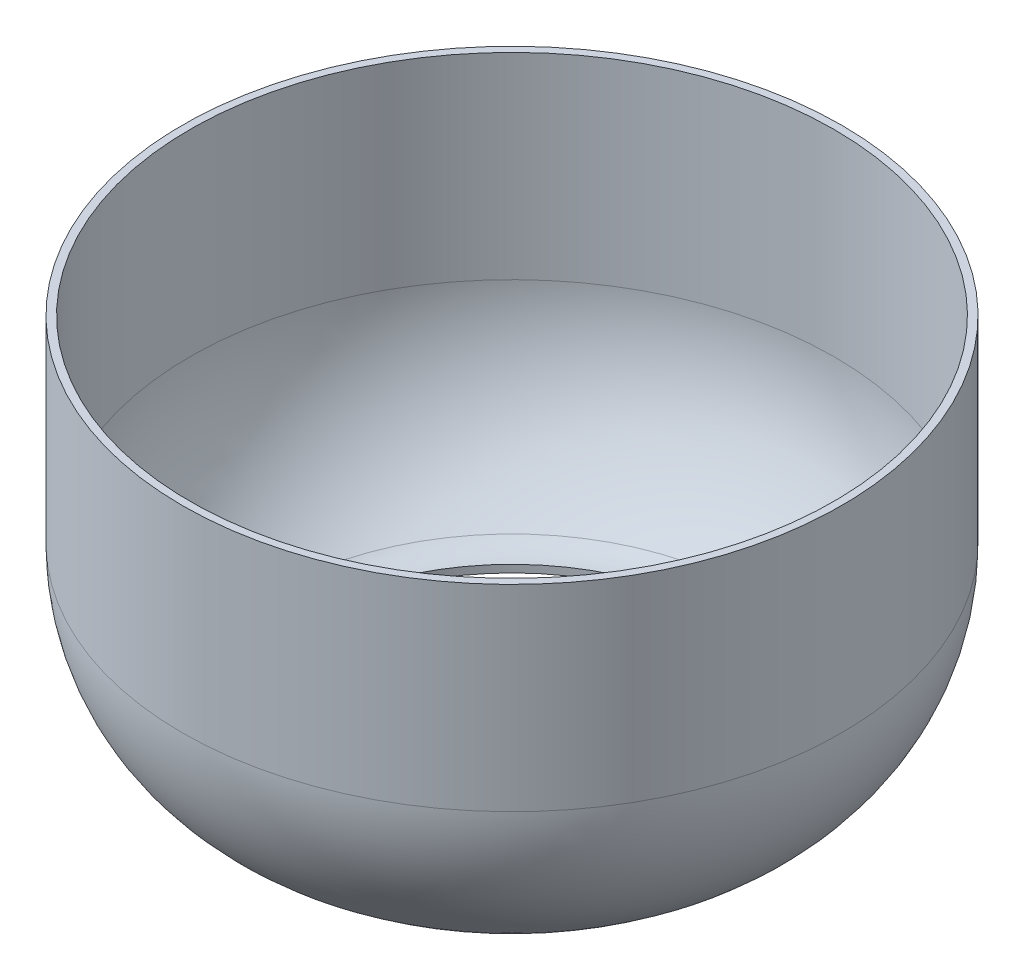
ISO-10303-21;
HEADER;
FILE_DESCRIPTION(('STEP AP214'),'2;1');
FILE_NAME('part.step','',(''),(''),'','','');
FILE_SCHEMA(('AUTOMOTIVE_DESIGN { 1 0 10303 214 1 1 1 1 }'));
ENDSEC;
DATA;
#1=APPLICATION_CONTEXT('core data for automotive mechanical design processes');
#2=APPLICATION_PROTOCOL_DEFINITION('international standard','automotive_design',2000,#1);
#3=PRODUCT_CONTEXT('',#1,'mechanical');
#4=PRODUCT('Part','Part','',(#3));
#5=PRODUCT_RELATED_PRODUCT_CATEGORY('part','',(#4));
#6=PRODUCT_DEFINITION_FORMATION('','',#4);
#7=PRODUCT_DEFINITION_CONTEXT('part definition',#1,'design');
#8=PRODUCT_DEFINITION('design','',#6,#7);
#9=PRODUCT_DEFINITION_SHAPE('','',#8);
#10=(LENGTH_UNIT() NAMED_UNIT(*) SI_UNIT(.MILLI.,.METRE.));
#11=(NAMED_UNIT(*) PLANE_ANGLE_UNIT() SI_UNIT($,.RADIAN.));
#12=(NAMED_UNIT(*) SI_UNIT($,.STERADIAN.) SOLID_ANGLE_UNIT());
#13=UNCERTAINTY_MEASURE_WITH_UNIT(LENGTH_MEASURE(1.E-05),#10,'distance_accuracy_value','');
#14=(GEOMETRIC_REPRESENTATION_CONTEXT(3) GLOBAL_UNCERTAINTY_ASSIGNED_CONTEXT((#13)) GLOBAL_UNIT_ASSIGNED_CONTEXT((#10,
#11,#12)) REPRESENTATION_CONTEXT('',''));
#15=CARTESIAN_POINT('',(0.,0.,0.));
#16=DIRECTION('',(0.,0.,1.));
#17=DIRECTION('',(1.,0.,0.));
#18=AXIS2_PLACEMENT_3D('',#15,#16,#17);
#19=CARTESIAN_POINT('',(0.,0.,0.));
#20=DIRECTION('',(0.,-1.,0.));
#21=DIRECTION('',(0.,0.,-1.));
#22=AXIS2_PLACEMENT_3D('',#19,#20,#21);
#23=DEGENERATE_TOROIDAL_SURFACE('',#22,25.12,39.38,.T.);
#24=CARTESIAN_POINT('',(0.,0.,0.));
#25=DIRECTION('',(0.,-1.,0.));
#26=DIRECTION('',(0.,0.,-1.));
#27=AXIS2_PLACEMENT_3D('',#24,#25,#26);
#28=CIRCLE('',#27,64.5);
#29=CARTESIAN_POINT('',(0.,0.,-64.5));
#30=VERTEX_POINT('',#29);
#31=EDGE_CURVE('E10',#30,#30,#28,.T.);
#32=ORIENTED_EDGE('',*,*,#31,.F.);
#33=EDGE_LOOP('',(#32));
#34=FACE_BOUND('',#33,.T.);
#35=CARTESIAN_POINT('',(0.,-32.2424353474893,0.));
#36=DIRECTION('',(0.,-1.,0.));
#37=DIRECTION('',(0.,0.,-1.));
#38=AXIS2_PLACEMENT_3D('',#35,#36,#37);
#39=CIRCLE('',#38,47.7299483162385);
#40=CARTESIAN_POINT('',(0.,-32.2424353474893,-47.7299483162385));
#41=VERTEX_POINT('',#40);
#42=EDGE_CURVE('E59',#41,#41,#39,.T.);
#43=ORIENTED_EDGE('',*,*,#42,.T.);
#44=EDGE_LOOP('',(#43));
#45=FACE_BOUND('',#44,.T.);
#46=ADVANCED_FACE('F31',(#34,#45),#23,.F.);
#47=CARTESIAN_POINT('',(0.,0.,0.));
#48=DIRECTION('',(0.,-1.,0.));
#49=DIRECTION('',(0.,0.,-1.));
#50=AXIS2_PLACEMENT_3D('',#47,#48,#49);
#51=CYLINDRICAL_SURFACE('',#50,64.5);
#52=CARTESIAN_POINT('',(0.,39.42,0.));
#53=DIRECTION('',(0.,-1.,0.));
#54=DIRECTION('',(0.,0.,-1.));
#55=AXIS2_PLACEMENT_3D('',#52,#53,#54);
#56=CIRCLE('',#55,64.5);
#57=CARTESIAN_POINT('',(0.,39.42,-64.5));
#58=VERTEX_POINT('',#57);
#59=EDGE_CURVE('E37',#58,#58,#56,.T.);
#60=ORIENTED_EDGE('',*,*,#59,.F.);
#61=EDGE_LOOP('',(#60));
#62=FACE_BOUND('',#61,.T.);
#63=ORIENTED_EDGE('',*,*,#31,.T.);
#64=EDGE_LOOP('',(#63));
#65=FACE_BOUND('',#64,.T.);
#66=ADVANCED_FACE('F96',(#62,#65),#51,.F.);
#67=CARTESIAN_POINT('',(-66.,39.42,0.));
#68=DIRECTION('',(0.,-1.,0.));
#69=DIRECTION('',(0.,0.,-1.));
#70=AXIS2_PLACEMENT_3D('',#67,#68,#69);
#71=PLANE('',#70);
#72=CARTESIAN_POINT('',(0.,39.42,0.));
#73=DIRECTION('',(0.,-1.,0.));
#74=DIRECTION('',(0.,0.,-1.));
#75=AXIS2_PLACEMENT_3D('',#72,#73,#74);
#76=CIRCLE('',#75,66.);
#77=CARTESIAN_POINT('',(0.,39.42,-66.));
#78=VERTEX_POINT('',#77);
#79=EDGE_CURVE('E41',#78,#78,#76,.T.);
#80=ORIENTED_EDGE('',*,*,#79,.F.);
#81=EDGE_LOOP('',(#80));
#82=FACE_BOUND('',#81,.T.);
#83=ORIENTED_EDGE('',*,*,#59,.T.);
#84=EDGE_LOOP('',(#83));
#85=FACE_BOUND('',#84,.T.);
#86=ADVANCED_FACE('F91',(#82,#85),#71,.F.);
#87=CARTESIAN_POINT('',(0.,0.,0.));
#88=DIRECTION('',(0.,-1.,0.));
#89=DIRECTION('',(0.,0.,-1.));
#90=AXIS2_PLACEMENT_3D('',#87,#88,#89);
#91=CYLINDRICAL_SURFACE('',#90,66.);
#92=CARTESIAN_POINT('',(0.,0.,0.));
#93=DIRECTION('',(0.,-1.,0.));
#94=DIRECTION('',(0.,0.,-1.));
#95=AXIS2_PLACEMENT_3D('',#92,#93,#94);
#96=CIRCLE('',#95,66.);
#97=CARTESIAN_POINT('',(0.,0.,-66.));
#98=VERTEX_POINT('',#97);
#99=EDGE_CURVE('E45',#98,#98,#96,.T.);
#100=ORIENTED_EDGE('',*,*,#99,.F.);
#101=EDGE_LOOP('',(#100));
#102=FACE_BOUND('',#101,.T.);
#103=ORIENTED_EDGE('',*,*,#79,.T.);
#104=EDGE_LOOP('',(#103));
#105=FACE_BOUND('',#104,.T.);
#106=ADVANCED_FACE('F85',(#102,#105),#91,.T.);
#107=CARTESIAN_POINT('',(0.,0.,0.));
#108=DIRECTION('',(0.,-1.,0.));
#109=DIRECTION('',(0.,0.,-1.));
#110=AXIS2_PLACEMENT_3D('',#107,#108,#109);
#111=DEGENERATE_TOROIDAL_SURFACE('',#110,25.12,40.88,.T.);
#112=CARTESIAN_POINT('',(0.,-33.4590757630955,0.));
#113=DIRECTION('',(0.,-1.,0.));
#114=DIRECTION('',(0.,0.,-1.));
#115=AXIS2_PLACEMENT_3D('',#112,#113,#114);
#116=CIRCLE('',#115,48.6075424231535);
#117=CARTESIAN_POINT('',(0.,-33.4590757630955,-48.6075424231535));
#118=VERTEX_POINT('',#117);
#119=EDGE_CURVE('E50',#118,#118,#116,.T.);
#120=ORIENTED_EDGE('',*,*,#119,.F.);
#121=EDGE_LOOP('',(#120));
#122=FACE_BOUND('',#121,.T.);
#123=ORIENTED_EDGE('',*,*,#99,.T.);
#124=EDGE_LOOP('',(#123));
#125=FACE_BOUND('',#124,.T.);
#126=ADVANCED_FACE('F79',(#122,#125),#111,.T.);
#127=CARTESIAN_POINT('',(0.,-25.42,0.));
#128=DIRECTION('',(0.,-1.,0.));
#129=DIRECTION('',(0.,0.,-1.));
#130=AXIS2_PLACEMENT_3D('',#127,#128,#129);
#131=TOROIDAL_SURFACE('',#130,42.66,10.);
#132=CARTESIAN_POINT('',(0.,-35.42,0.));
#133=DIRECTION('',(0.,-1.,0.));
#134=DIRECTION('',(0.,0.,-1.));
#135=AXIS2_PLACEMENT_3D('',#132,#133,#134);
#136=CIRCLE('',#135,42.66);
#137=CARTESIAN_POINT('',(0.,-35.42,-42.66));
#138=VERTEX_POINT('',#137);
#139=EDGE_CURVE('E53',#138,#138,#136,.T.);
#140=ORIENTED_EDGE('',*,*,#139,.F.);
#141=EDGE_LOOP('',(#140));
#142=FACE_BOUND('',#141,.T.);
#143=ORIENTED_EDGE('',*,*,#119,.T.);
#144=EDGE_LOOP('',(#143));
#145=FACE_BOUND('',#144,.T.);
#146=ADVANCED_FACE('F73',(#142,#145),#131,.T.);
#147=CARTESIAN_POINT('',(0.,0.,0.));
#148=DIRECTION('',(0.,-1.,0.));
#149=DIRECTION('',(0.,0.,-1.));
#150=AXIS2_PLACEMENT_3D('',#147,#148,#149);
#151=CYLINDRICAL_SURFACE('',#150,42.66);
#152=CARTESIAN_POINT('',(0.,-33.92,0.));
#153=DIRECTION('',(0.,-1.,0.));
#154=DIRECTION('',(0.,0.,-1.));
#155=AXIS2_PLACEMENT_3D('',#152,#153,#154);
#156=CIRCLE('',#155,42.66);
#157=CARTESIAN_POINT('',(0.,-33.92,-42.66));
#158=VERTEX_POINT('',#157);
#159=EDGE_CURVE('E56',#158,#158,#156,.T.);
#160=ORIENTED_EDGE('',*,*,#159,.F.);
#161=EDGE_LOOP('',(#160));
#162=FACE_BOUND('',#161,.T.);
#163=ORIENTED_EDGE('',*,*,#139,.T.);
#164=EDGE_LOOP('',(#163));
#165=FACE_BOUND('',#164,.T.);
#166=ADVANCED_FACE('F67',(#162,#165),#151,.F.);
#167=CARTESIAN_POINT('',(0.,-25.42,0.));
#168=DIRECTION('',(0.,-1.,0.));
#169=DIRECTION('',(0.,0.,-1.));
#170=AXIS2_PLACEMENT_3D('',#167,#168,#169);
#171=TOROIDAL_SURFACE('',#170,42.66,8.50000000000001);
#172=ORIENTED_EDGE('',*,*,#42,.F.);
#173=EDGE_LOOP('',(#172));
#174=FACE_BOUND('',#173,.T.);
#175=ORIENTED_EDGE('',*,*,#159,.T.);
#176=EDGE_LOOP('',(#175));
#177=FACE_BOUND('',#176,.T.);
#178=ADVANCED_FACE('F64',(#174,#177),#171,.F.);
#179=CLOSED_SHELL('',(#46,#66,#86,#106,#126,#146,#166,#178));
#180=MANIFOLD_SOLID_BREP('B2',#179);
#181=ADVANCED_BREP_SHAPE_REPRESENTATION('',(#18,#180),#14);
#182=SHAPE_DEFINITION_REPRESENTATION(#9,#181);
ENDSEC;
END-ISO-10303-21;
